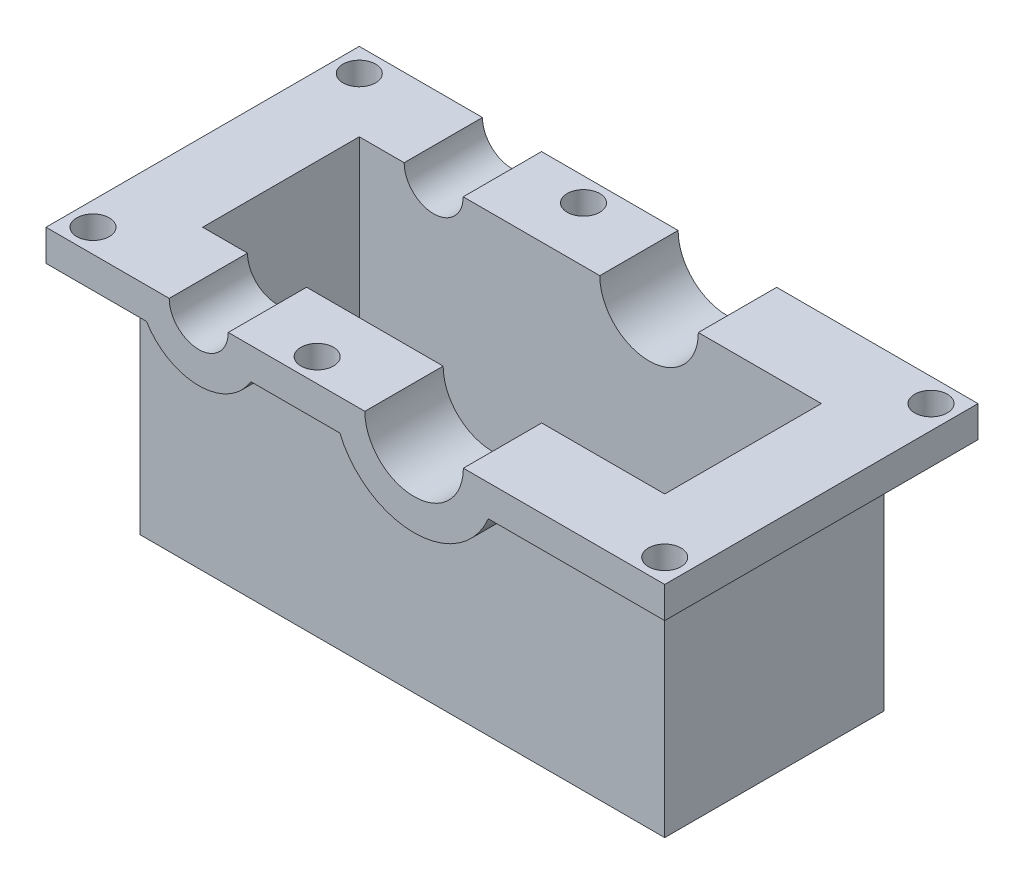
ISO-10303-21;
HEADER;
FILE_DESCRIPTION(('STEP AP214'),'2;1');
FILE_NAME('part.step','',(''),(''),'','','');
FILE_SCHEMA(('AUTOMOTIVE_DESIGN { 1 0 10303 214 1 1 1 1 }'));
ENDSEC;
DATA;
#1=APPLICATION_CONTEXT('core data for automotive mechanical design processes');
#2=APPLICATION_PROTOCOL_DEFINITION('international standard','automotive_design',2000,#1);
#3=PRODUCT_CONTEXT('',#1,'mechanical');
#4=PRODUCT('Part','Part','',(#3));
#5=PRODUCT_RELATED_PRODUCT_CATEGORY('part','',(#4));
#6=PRODUCT_DEFINITION_FORMATION('','',#4);
#7=PRODUCT_DEFINITION_CONTEXT('part definition',#1,'design');
#8=PRODUCT_DEFINITION('design','',#6,#7);
#9=PRODUCT_DEFINITION_SHAPE('','',#8);
#10=(LENGTH_UNIT() NAMED_UNIT(*) SI_UNIT(.MILLI.,.METRE.));
#11=(NAMED_UNIT(*) PLANE_ANGLE_UNIT() SI_UNIT($,.RADIAN.));
#12=(NAMED_UNIT(*) SI_UNIT($,.STERADIAN.) SOLID_ANGLE_UNIT());
#13=UNCERTAINTY_MEASURE_WITH_UNIT(LENGTH_MEASURE(1.E-05),#10,'distance_accuracy_value','');
#14=(GEOMETRIC_REPRESENTATION_CONTEXT(3) GLOBAL_UNCERTAINTY_ASSIGNED_CONTEXT((#13)) GLOBAL_UNIT_ASSIGNED_CONTEXT((#10,
#11,#12)) REPRESENTATION_CONTEXT('',''));
#15=CARTESIAN_POINT('',(0.,0.,0.));
#16=DIRECTION('',(0.,0.,1.));
#17=DIRECTION('',(1.,0.,0.));
#18=AXIS2_PLACEMENT_3D('',#15,#16,#17);
#19=CARTESIAN_POINT('',(0.,19.05,0.));
#20=DIRECTION('',(0.,1.,0.));
#21=DIRECTION('',(0.,0.,1.));
#22=AXIS2_PLACEMENT_3D('',#19,#20,#21);
#23=PLANE('',#22);
#24=DIRECTION('',(0.,0.,-1.));
#25=VECTOR('',#24,1.);
#26=CARTESIAN_POINT('',(-16.9299246568349,19.05,25.3857124006695));
#27=LINE('',#26,#25);
#28=CARTESIAN_POINT('',(-16.9299246568349,19.05,12.7));
#29=VERTEX_POINT('',#28);
#30=CARTESIAN_POINT('',(-16.9299246568349,19.05,8.89));
#31=VERTEX_POINT('',#30);
#32=EDGE_CURVE('E253',#29,#31,#27,.T.);
#33=ORIENTED_EDGE('',*,*,#32,.F.);
#34=DIRECTION('',(1.,0.,0.));
#35=VECTOR('',#34,1.);
#36=CARTESIAN_POINT('',(-25.0825,19.05,12.7));
#37=LINE('',#36,#35);
#38=CARTESIAN_POINT('',(-25.0825,19.05,12.7));
#39=VERTEX_POINT('',#38);
#40=EDGE_CURVE('E266',#39,#29,#37,.T.);
#41=ORIENTED_EDGE('',*,*,#40,.F.);
#42=DIRECTION('',(0.,0.,1.));
#43=VECTOR('',#42,1.);
#44=CARTESIAN_POINT('',(-25.0825,19.05,-12.7));
#45=LINE('',#44,#43);
#46=CARTESIAN_POINT('',(-25.0825,19.05,-12.7));
#47=VERTEX_POINT('',#46);
#48=EDGE_CURVE('E286',#47,#39,#45,.T.);
#49=ORIENTED_EDGE('',*,*,#48,.F.);
#50=DIRECTION('',(-1.,0.,0.));
#51=VECTOR('',#50,1.);
#52=CARTESIAN_POINT('',(-25.0825,19.05,-12.7));
#53=LINE('',#52,#51);
#54=CARTESIAN_POINT('',(-16.9299246568349,19.05,-12.7));
#55=VERTEX_POINT('',#54);
#56=EDGE_CURVE('E297',#55,#47,#53,.T.);
#57=ORIENTED_EDGE('',*,*,#56,.F.);
#58=DIRECTION('',(0.,0.,1.));
#59=VECTOR('',#58,1.);
#60=CARTESIAN_POINT('',(-16.9299246568349,19.05,-25.3857124006695));
#61=LINE('',#60,#59);
#62=CARTESIAN_POINT('',(-16.9299246568349,19.05,-8.89));
#63=VERTEX_POINT('',#62);
#64=EDGE_CURVE('E361',#55,#63,#61,.T.);
#65=ORIENTED_EDGE('',*,*,#64,.T.);
#66=DIRECTION('',(-1.,0.,0.));
#67=VECTOR('',#66,1.);
#68=CARTESIAN_POINT('',(21.2725,19.05,-8.89));
#69=LINE('',#68,#67);
#70=CARTESIAN_POINT('',(-21.2725,19.05,-8.89));
#71=VERTEX_POINT('',#70);
#72=EDGE_CURVE('E310',#63,#71,#69,.T.);
#73=ORIENTED_EDGE('',*,*,#72,.T.);
#74=DIRECTION('',(0.,0.,1.));
#75=VECTOR('',#74,1.);
#76=CARTESIAN_POINT('',(-21.2725,19.05,-8.89));
#77=LINE('',#76,#75);
#78=CARTESIAN_POINT('',(-21.2725,19.05,8.89));
#79=VERTEX_POINT('',#78);
#80=EDGE_CURVE('E319',#71,#79,#77,.T.);
#81=ORIENTED_EDGE('',*,*,#80,.T.);
#82=DIRECTION('',(1.,0.,0.));
#83=VECTOR('',#82,1.);
#84=CARTESIAN_POINT('',(-21.2725,19.05,8.89));
#85=LINE('',#84,#83);
#86=EDGE_CURVE('E268',#79,#31,#85,.T.);
#87=ORIENTED_EDGE('',*,*,#86,.T.);
#88=EDGE_LOOP('',(#33,#41,#49,#57,#65,#73,#81,#87));
#89=FACE_BOUND('',#88,.T.);
#90=CARTESIAN_POINT('',(-23.1775,19.05,-10.795));
#91=DIRECTION('',(0.,1.,0.));
#92=DIRECTION('',(0.,0.,1.));
#93=AXIS2_PLACEMENT_3D('',#90,#91,#92);
#94=CIRCLE('',#93,1.32117066907396);
#95=CARTESIAN_POINT('',(-23.1775,19.05,-9.47382933092604));
#96=VERTEX_POINT('',#95);
#97=EDGE_CURVE('E428',#96,#96,#94,.F.);
#98=ORIENTED_EDGE('',*,*,#97,.F.);
#99=EDGE_LOOP('',(#98));
#100=FACE_BOUND('',#99,.T.);
#101=CARTESIAN_POINT('',(-23.1775,19.05,10.795));
#102=DIRECTION('',(0.,1.,0.));
#103=DIRECTION('',(0.,0.,1.));
#104=AXIS2_PLACEMENT_3D('',#101,#102,#103);
#105=CIRCLE('',#104,1.32117066907396);
#106=CARTESIAN_POINT('',(-23.1775,19.05,12.116170669074));
#107=VERTEX_POINT('',#106);
#108=EDGE_CURVE('E424',#107,#107,#105,.T.);
#109=ORIENTED_EDGE('',*,*,#108,.T.);
#110=EDGE_LOOP('',(#109));
#111=FACE_BOUND('',#110,.T.);
#112=ADVANCED_FACE('F68',(#89,#100,#111),#23,.F.);
#113=DIRECTION('',(0.,0.,-1.));
#114=VECTOR('',#113,1.);
#115=CARTESIAN_POINT('',(10.7827588169031,19.05,25.3857124006695));
#116=LINE('',#115,#114);
#117=CARTESIAN_POINT('',(10.7827588169031,19.05,12.7));
#118=VERTEX_POINT('',#117);
#119=CARTESIAN_POINT('',(10.7827588169031,19.05,8.89));
#120=VERTEX_POINT('',#119);
#121=EDGE_CURVE('E392',#118,#120,#116,.T.);
#122=ORIENTED_EDGE('',*,*,#121,.T.);
#123=CARTESIAN_POINT('',(21.2725,19.05,8.89));
#124=VERTEX_POINT('',#123);
#125=EDGE_CURVE('E318',#120,#124,#85,.T.);
#126=ORIENTED_EDGE('',*,*,#125,.T.);
#127=DIRECTION('',(0.,0.,-1.));
#128=VECTOR('',#127,1.);
#129=CARTESIAN_POINT('',(21.2725,19.05,8.89));
#130=LINE('',#129,#128);
#131=CARTESIAN_POINT('',(21.2725,19.05,-8.89));
#132=VERTEX_POINT('',#131);
#133=EDGE_CURVE('E311',#124,#132,#130,.T.);
#134=ORIENTED_EDGE('',*,*,#133,.T.);
#135=CARTESIAN_POINT('',(10.7827588169031,19.05,-8.89));
#136=VERTEX_POINT('',#135);
#137=EDGE_CURVE('E304',#132,#136,#69,.T.);
#138=ORIENTED_EDGE('',*,*,#137,.T.);
#139=DIRECTION('',(0.,0.,1.));
#140=VECTOR('',#139,1.);
#141=CARTESIAN_POINT('',(10.7827588169031,19.05,-25.3857124006695));
#142=LINE('',#141,#140);
#143=CARTESIAN_POINT('',(10.7827588169031,19.05,-12.7));
#144=VERTEX_POINT('',#143);
#145=EDGE_CURVE('E381',#144,#136,#142,.T.);
#146=ORIENTED_EDGE('',*,*,#145,.F.);
#147=CARTESIAN_POINT('',(25.0825,19.05,-12.7));
#148=VERTEX_POINT('',#147);
#149=EDGE_CURVE('E290',#148,#144,#53,.T.);
#150=ORIENTED_EDGE('',*,*,#149,.F.);
#151=DIRECTION('',(0.,0.,-1.));
#152=VECTOR('',#151,1.);
#153=CARTESIAN_POINT('',(25.0825,19.05,-12.7));
#154=LINE('',#153,#152);
#155=CARTESIAN_POINT('',(25.0825,19.05,12.7));
#156=VERTEX_POINT('',#155);
#157=EDGE_CURVE('E299',#156,#148,#154,.T.);
#158=ORIENTED_EDGE('',*,*,#157,.F.);
#159=EDGE_CURVE('E278',#118,#156,#37,.T.);
#160=ORIENTED_EDGE('',*,*,#159,.F.);
#161=EDGE_LOOP('',(#122,#126,#134,#138,#146,#150,#158,#160));
#162=FACE_BOUND('',#161,.T.);
#163=CARTESIAN_POINT('',(23.1775,19.05,-10.795));
#164=DIRECTION('',(0.,1.,0.));
#165=DIRECTION('',(0.,0.,1.));
#166=AXIS2_PLACEMENT_3D('',#163,#164,#165);
#167=CIRCLE('',#166,1.32117066907396);
#168=CARTESIAN_POINT('',(23.1775,19.05,-9.47382933092604));
#169=VERTEX_POINT('',#168);
#170=EDGE_CURVE('E420',#169,#169,#167,.F.);
#171=ORIENTED_EDGE('',*,*,#170,.F.);
#172=EDGE_LOOP('',(#171));
#173=FACE_BOUND('',#172,.T.);
#174=CARTESIAN_POINT('',(23.1775,19.05,10.795));
#175=DIRECTION('',(0.,1.,0.));
#176=DIRECTION('',(0.,0.,1.));
#177=AXIS2_PLACEMENT_3D('',#174,#175,#176);
#178=CIRCLE('',#177,1.32117066907396);
#179=CARTESIAN_POINT('',(23.1775,19.05,12.116170669074));
#180=VERTEX_POINT('',#179);
#181=EDGE_CURVE('E416',#180,#180,#178,.T.);
#182=ORIENTED_EDGE('',*,*,#181,.T.);
#183=EDGE_LOOP('',(#182));
#184=FACE_BOUND('',#183,.T.);
#185=ADVANCED_FACE('F670',(#162,#173,#184),#23,.F.);
#186=CARTESIAN_POINT('',(0.,21.59,0.));
#187=DIRECTION('',(0.,1.,0.));
#188=DIRECTION('',(0.,0.,1.));
#189=AXIS2_PLACEMENT_3D('',#186,#187,#188);
#190=PLANE('',#189);
#191=CARTESIAN_POINT('',(23.1775,21.59,-10.795));
#192=DIRECTION('',(0.,1.,0.));
#193=DIRECTION('',(0.,0.,1.));
#194=AXIS2_PLACEMENT_3D('',#191,#192,#193);
#195=CIRCLE('',#194,1.32117066907396);
#196=CARTESIAN_POINT('',(23.1775,21.59,-9.47382933092604));
#197=VERTEX_POINT('',#196);
#198=EDGE_CURVE('E432',#197,#197,#195,.T.);
#199=ORIENTED_EDGE('',*,*,#198,.F.);
#200=EDGE_LOOP('',(#199));
#201=FACE_BOUND('',#200,.T.);
#202=DIRECTION('',(0.,0.,-1.));
#203=VECTOR('',#202,1.);
#204=CARTESIAN_POINT('',(8.75665,21.59,23.997162200305));
#205=LINE('',#204,#203);
#206=CARTESIAN_POINT('',(8.75665,21.59,12.7));
#207=VERTEX_POINT('',#206);
#208=CARTESIAN_POINT('',(8.75665,21.59,6.35));
#209=VERTEX_POINT('',#208);
#210=EDGE_CURVE('E336',#207,#209,#205,.T.);
#211=ORIENTED_EDGE('',*,*,#210,.F.);
#212=DIRECTION('',(1.,0.,0.));
#213=VECTOR('',#212,1.);
#214=CARTESIAN_POINT('',(-25.0825,21.59,12.7));
#215=LINE('',#214,#213);
#216=CARTESIAN_POINT('',(25.0825,21.59,12.7));
#217=VERTEX_POINT('',#216);
#218=EDGE_CURVE('E603',#207,#217,#215,.T.);
#219=ORIENTED_EDGE('',*,*,#218,.T.);
#220=DIRECTION('',(0.,0.,-1.));
#221=VECTOR('',#220,1.);
#222=CARTESIAN_POINT('',(25.0825,21.59,-12.7));
#223=LINE('',#222,#221);
#224=CARTESIAN_POINT('',(25.0825,21.59,-12.7));
#225=VERTEX_POINT('',#224);
#226=EDGE_CURVE('E308',#217,#225,#223,.T.);
#227=ORIENTED_EDGE('',*,*,#226,.T.);
#228=DIRECTION('',(-1.,0.,0.));
#229=VECTOR('',#228,1.);
#230=CARTESIAN_POINT('',(-25.0825,21.59,-12.7));
#231=LINE('',#230,#229);
#232=CARTESIAN_POINT('',(8.75665,21.59,-12.7));
#233=VERTEX_POINT('',#232);
#234=EDGE_CURVE('E709',#225,#233,#231,.T.);
#235=ORIENTED_EDGE('',*,*,#234,.T.);
#236=CARTESIAN_POINT('',(8.75665,21.59,-6.35));
#237=VERTEX_POINT('',#236);
#238=EDGE_CURVE('E341',#237,#233,#205,.T.);
#239=ORIENTED_EDGE('',*,*,#238,.F.);
#240=DIRECTION('',(-1.,0.,0.));
#241=VECTOR('',#240,1.);
#242=CARTESIAN_POINT('',(21.2725,21.59,-6.35));
#243=LINE('',#242,#241);
#244=CARTESIAN_POINT('',(18.7325,21.59,-6.35));
#245=VERTEX_POINT('',#244);
#246=EDGE_CURVE('E484',#245,#237,#243,.T.);
#247=ORIENTED_EDGE('',*,*,#246,.F.);
#248=DIRECTION('',(0.,0.,-1.));
#249=VECTOR('',#248,1.);
#250=CARTESIAN_POINT('',(18.7325,21.59,8.89));
#251=LINE('',#250,#249);
#252=CARTESIAN_POINT('',(18.7325,21.59,6.35));
#253=VERTEX_POINT('',#252);
#254=EDGE_CURVE('E490',#253,#245,#251,.T.);
#255=ORIENTED_EDGE('',*,*,#254,.F.);
#256=DIRECTION('',(1.,0.,0.));
#257=VECTOR('',#256,1.);
#258=CARTESIAN_POINT('',(-21.2725,21.59,6.35));
#259=LINE('',#258,#257);
#260=EDGE_CURVE('E510',#209,#253,#259,.T.);
#261=ORIENTED_EDGE('',*,*,#260,.F.);
#262=EDGE_LOOP('',(#211,#219,#227,#235,#239,#247,#255,#261));
#263=FACE_BOUND('',#262,.T.);
#264=CARTESIAN_POINT('',(23.1775,21.59,10.795));
#265=DIRECTION('',(0.,-1.,0.));
#266=DIRECTION('',(0.,0.,-1.));
#267=AXIS2_PLACEMENT_3D('',#264,#265,#266);
#268=CIRCLE('',#267,1.32117066907396);
#269=CARTESIAN_POINT('',(23.1775,21.59,9.47382933092604));
#270=VERTEX_POINT('',#269);
#271=EDGE_CURVE('E437',#270,#270,#268,.T.);
#272=ORIENTED_EDGE('',*,*,#271,.T.);
#273=EDGE_LOOP('',(#272));
#274=FACE_BOUND('',#273,.T.);
#275=ADVANCED_FACE('F640',(#201,#263,#274),#190,.T.);
#276=CARTESIAN_POINT('',(-23.1775,21.59,-10.795));
#277=DIRECTION('',(0.,1.,0.));
#278=DIRECTION('',(0.,0.,1.));
#279=AXIS2_PLACEMENT_3D('',#276,#277,#278);
#280=CIRCLE('',#279,1.32117066907396);
#281=CARTESIAN_POINT('',(-23.1775,21.59,-9.47382933092604));
#282=VERTEX_POINT('',#281);
#283=EDGE_CURVE('E449',#282,#282,#280,.T.);
#284=ORIENTED_EDGE('',*,*,#283,.F.);
#285=EDGE_LOOP('',(#284));
#286=FACE_BOUND('',#285,.T.);
#287=DIRECTION('',(0.,0.,-1.));
#288=VECTOR('',#287,1.);
#289=CARTESIAN_POINT('',(-15.09395,21.59,23.997162200305));
#290=LINE('',#289,#288);
#291=CARTESIAN_POINT('',(-15.09395,21.59,-12.7));
#292=VERTEX_POINT('',#291);
#293=CARTESIAN_POINT('',(-15.09395,21.59,-6.35));
#294=VERTEX_POINT('',#293);
#295=EDGE_CURVE('E330',#292,#294,#290,.F.);
#296=ORIENTED_EDGE('',*,*,#295,.F.);
#297=CARTESIAN_POINT('',(-25.0825,21.59,-12.7));
#298=VERTEX_POINT('',#297);
#299=EDGE_CURVE('E710',#292,#298,#231,.T.);
#300=ORIENTED_EDGE('',*,*,#299,.T.);
#301=DIRECTION('',(0.,0.,1.));
#302=VECTOR('',#301,1.);
#303=CARTESIAN_POINT('',(-25.0825,21.59,-12.7));
#304=LINE('',#303,#302);
#305=CARTESIAN_POINT('',(-25.0825,21.59,12.7));
#306=VERTEX_POINT('',#305);
#307=EDGE_CURVE('E608',#298,#306,#304,.T.);
#308=ORIENTED_EDGE('',*,*,#307,.T.);
#309=CARTESIAN_POINT('',(-15.09395,21.59,12.7));
#310=VERTEX_POINT('',#309);
#311=EDGE_CURVE('E303',#306,#310,#215,.T.);
#312=ORIENTED_EDGE('',*,*,#311,.T.);
#313=CARTESIAN_POINT('',(-15.09395,21.59,6.35));
#314=VERTEX_POINT('',#313);
#315=EDGE_CURVE('E326',#314,#310,#290,.F.);
#316=ORIENTED_EDGE('',*,*,#315,.F.);
#317=CARTESIAN_POINT('',(-18.7325,21.59,6.35));
#318=VERTEX_POINT('',#317);
#319=EDGE_CURVE('E618',#318,#314,#259,.T.);
#320=ORIENTED_EDGE('',*,*,#319,.F.);
#321=DIRECTION('',(0.,0.,1.));
#322=VECTOR('',#321,1.);
#323=CARTESIAN_POINT('',(-18.7325,21.59,-8.89));
#324=LINE('',#323,#322);
#325=CARTESIAN_POINT('',(-18.7325,21.59,-6.35));
#326=VERTEX_POINT('',#325);
#327=EDGE_CURVE('E489',#326,#318,#324,.T.);
#328=ORIENTED_EDGE('',*,*,#327,.F.);
#329=EDGE_CURVE('E485',#294,#326,#243,.T.);
#330=ORIENTED_EDGE('',*,*,#329,.F.);
#331=EDGE_LOOP('',(#296,#300,#308,#312,#316,#320,#328,#330));
#332=FACE_BOUND('',#331,.T.);
#333=CARTESIAN_POINT('',(-23.1775,21.59,10.795));
#334=DIRECTION('',(0.,-1.,0.));
#335=DIRECTION('',(0.,0.,-1.));
#336=AXIS2_PLACEMENT_3D('',#333,#334,#335);
#337=CIRCLE('',#336,1.32117066907396);
#338=CARTESIAN_POINT('',(-23.1775,21.59,9.47382933092604));
#339=VERTEX_POINT('',#338);
#340=EDGE_CURVE('E445',#339,#339,#337,.T.);
#341=ORIENTED_EDGE('',*,*,#340,.T.);
#342=EDGE_LOOP('',(#341));
#343=FACE_BOUND('',#342,.T.);
#344=ADVANCED_FACE('F466',(#286,#332,#343),#190,.T.);
#345=CARTESIAN_POINT('',(-5.00026562264999,19.05,10.795));
#346=DIRECTION('',(0.,1.,0.));
#347=DIRECTION('',(0.,0.,1.));
#348=AXIS2_PLACEMENT_3D('',#345,#346,#347);
#349=CIRCLE('',#348,1.32117066907395);
#350=CARTESIAN_POINT('',(-5.00026562264999,19.05,12.116170669074));
#351=VERTEX_POINT('',#350);
#352=EDGE_CURVE('E412',#351,#351,#349,.T.);
#353=ORIENTED_EDGE('',*,*,#352,.T.);
#354=EDGE_LOOP('',(#353));
#355=FACE_BOUND('',#354,.T.);
#356=DIRECTION('',(0.,0.,-1.));
#357=VECTOR('',#356,1.);
#358=CARTESIAN_POINT('',(-8.47007534316508,19.05,25.3857124006695));
#359=LINE('',#358,#357);
#360=CARTESIAN_POINT('',(-8.47007534316508,19.05,12.7));
#361=VERTEX_POINT('',#360);
#362=CARTESIAN_POINT('',(-8.47007534316508,19.05,8.89));
#363=VERTEX_POINT('',#362);
#364=EDGE_CURVE('E256',#361,#363,#359,.T.);
#365=ORIENTED_EDGE('',*,*,#364,.T.);
#366=CARTESIAN_POINT('',(-1.25775881690314,19.05,8.89));
#367=VERTEX_POINT('',#366);
#368=EDGE_CURVE('E317',#363,#367,#85,.T.);
#369=ORIENTED_EDGE('',*,*,#368,.T.);
#370=DIRECTION('',(0.,0.,-1.));
#371=VECTOR('',#370,1.);
#372=CARTESIAN_POINT('',(-1.25775881690314,19.05,25.3857124006695));
#373=LINE('',#372,#371);
#374=CARTESIAN_POINT('',(-1.25775881690314,19.05,12.7));
#375=VERTEX_POINT('',#374);
#376=EDGE_CURVE('E258',#375,#367,#373,.T.);
#377=ORIENTED_EDGE('',*,*,#376,.F.);
#378=EDGE_CURVE('E89',#361,#375,#37,.T.);
#379=ORIENTED_EDGE('',*,*,#378,.F.);
#380=EDGE_LOOP('',(#365,#369,#377,#379));
#381=FACE_BOUND('',#380,.T.);
#382=ADVANCED_FACE('F676',(#355,#381),#23,.F.);
#383=CARTESIAN_POINT('',(-21.2725,2.54,8.89));
#384=DIRECTION('',(0.,0.,-1.));
#385=DIRECTION('',(-1.,0.,0.));
#386=AXIS2_PLACEMENT_3D('',#383,#384,#385);
#387=PLANE('',#386);
#388=CARTESIAN_POINT('',(-12.7,21.59,8.89));
#389=DIRECTION('',(0.,0.,1.));
#390=DIRECTION('',(1.,0.,0.));
#391=AXIS2_PLACEMENT_3D('',#388,#389,#390);
#392=CIRCLE('',#391,4.93395);
#393=EDGE_CURVE('E259',#31,#363,#392,.T.);
#394=ORIENTED_EDGE('',*,*,#393,.F.);
#395=ORIENTED_EDGE('',*,*,#86,.F.);
#396=DIRECTION('',(0.,-1.,0.));
#397=VECTOR('',#396,1.);
#398=CARTESIAN_POINT('',(-21.2725,2.54,8.89));
#399=LINE('',#398,#397);
#400=CARTESIAN_POINT('',(-21.2725,0.,8.89));
#401=VERTEX_POINT('',#400);
#402=EDGE_CURVE('E545',#79,#401,#399,.T.);
#403=ORIENTED_EDGE('',*,*,#402,.T.);
#404=DIRECTION('',(1.,0.,0.));
#405=VECTOR('',#404,1.);
#406=CARTESIAN_POINT('',(-21.2725,0.,8.89));
#407=LINE('',#406,#405);
#408=CARTESIAN_POINT('',(21.2725,0.,8.89));
#409=VERTEX_POINT('',#408);
#410=EDGE_CURVE('E538',#401,#409,#407,.T.);
#411=ORIENTED_EDGE('',*,*,#410,.T.);
#412=DIRECTION('',(0.,-1.,0.));
#413=VECTOR('',#412,1.);
#414=CARTESIAN_POINT('',(21.2725,2.54,8.89));
#415=LINE('',#414,#413);
#416=EDGE_CURVE('E542',#124,#409,#415,.T.);
#417=ORIENTED_EDGE('',*,*,#416,.F.);
#418=ORIENTED_EDGE('',*,*,#125,.F.);
#419=CARTESIAN_POINT('',(4.7625,21.59,8.89));
#420=DIRECTION('',(0.,0.,1.));
#421=DIRECTION('',(1.,0.,0.));
#422=AXIS2_PLACEMENT_3D('',#419,#420,#421);
#423=CIRCLE('',#422,6.53415);
#424=EDGE_CURVE('E395',#367,#120,#423,.T.);
#425=ORIENTED_EDGE('',*,*,#424,.F.);
#426=ORIENTED_EDGE('',*,*,#368,.F.);
#427=EDGE_LOOP('',(#394,#395,#403,#411,#417,#418,#425,#426));
#428=FACE_BOUND('',#427,.T.);
#429=ADVANCED_FACE('F565',(#428),#387,.F.);
#430=CARTESIAN_POINT('',(-5.00026562264999,19.05,-10.795));
#431=DIRECTION('',(0.,1.,0.));
#432=DIRECTION('',(0.,0.,1.));
#433=AXIS2_PLACEMENT_3D('',#430,#431,#432);
#434=CIRCLE('',#433,1.32117066907395);
#435=CARTESIAN_POINT('',(-5.00026562264999,19.05,-9.47382933092604));
#436=VERTEX_POINT('',#435);
#437=EDGE_CURVE('E405',#436,#436,#434,.F.);
#438=ORIENTED_EDGE('',*,*,#437,.F.);
#439=EDGE_LOOP('',(#438));
#440=FACE_BOUND('',#439,.T.);
#441=DIRECTION('',(0.,0.,1.));
#442=VECTOR('',#441,1.);
#443=CARTESIAN_POINT('',(-1.25775881690314,19.05,-25.3857124006695));
#444=LINE('',#443,#442);
#445=CARTESIAN_POINT('',(-1.25775881690314,19.05,-12.7));
#446=VERTEX_POINT('',#445);
#447=CARTESIAN_POINT('',(-1.25775881690314,19.05,-8.89));
#448=VERTEX_POINT('',#447);
#449=EDGE_CURVE('E377',#446,#448,#444,.T.);
#450=ORIENTED_EDGE('',*,*,#449,.T.);
#451=CARTESIAN_POINT('',(-8.47007534316509,19.05,-8.89));
#452=VERTEX_POINT('',#451);
#453=EDGE_CURVE('E309',#448,#452,#69,.T.);
#454=ORIENTED_EDGE('',*,*,#453,.T.);
#455=DIRECTION('',(0.,0.,1.));
#456=VECTOR('',#455,1.);
#457=CARTESIAN_POINT('',(-8.47007534316509,19.05,-25.3857124006695));
#458=LINE('',#457,#456);
#459=CARTESIAN_POINT('',(-8.47007534316508,19.05,-12.7));
#460=VERTEX_POINT('',#459);
#461=EDGE_CURVE('E365',#460,#452,#458,.T.);
#462=ORIENTED_EDGE('',*,*,#461,.F.);
#463=EDGE_CURVE('E295',#446,#460,#53,.T.);
#464=ORIENTED_EDGE('',*,*,#463,.F.);
#465=EDGE_LOOP('',(#450,#454,#462,#464));
#466=FACE_BOUND('',#465,.T.);
#467=ADVANCED_FACE('F579',(#440,#466),#23,.F.);
#468=CARTESIAN_POINT('',(-21.2725,2.54,-8.89));
#469=DIRECTION('',(0.,0.,1.));
#470=DIRECTION('',(1.,0.,0.));
#471=AXIS2_PLACEMENT_3D('',#468,#469,#470);
#472=PLANE('',#471);
#473=CARTESIAN_POINT('',(4.7625,21.59,-8.89));
#474=DIRECTION('',(0.,0.,-1.));
#475=DIRECTION('',(-1.,0.,0.));
#476=AXIS2_PLACEMENT_3D('',#473,#474,#475);
#477=CIRCLE('',#476,6.53415);
#478=EDGE_CURVE('E380',#136,#448,#477,.T.);
#479=ORIENTED_EDGE('',*,*,#478,.F.);
#480=ORIENTED_EDGE('',*,*,#137,.F.);
#481=DIRECTION('',(0.,-1.,0.));
#482=VECTOR('',#481,1.);
#483=CARTESIAN_POINT('',(21.2725,2.54,-8.89));
#484=LINE('',#483,#482);
#485=CARTESIAN_POINT('',(21.2725,0.,-8.89));
#486=VERTEX_POINT('',#485);
#487=EDGE_CURVE('E77',#132,#486,#484,.T.);
#488=ORIENTED_EDGE('',*,*,#487,.T.);
#489=DIRECTION('',(-1.,0.,0.));
#490=VECTOR('',#489,1.);
#491=CARTESIAN_POINT('',(-21.2725,0.,-8.89));
#492=LINE('',#491,#490);
#493=CARTESIAN_POINT('',(-21.2725,0.,-8.89));
#494=VERTEX_POINT('',#493);
#495=EDGE_CURVE('E530',#486,#494,#492,.T.);
#496=ORIENTED_EDGE('',*,*,#495,.T.);
#497=DIRECTION('',(0.,-1.,0.));
#498=VECTOR('',#497,1.);
#499=CARTESIAN_POINT('',(-21.2725,2.54,-8.89));
#500=LINE('',#499,#498);
#501=EDGE_CURVE('E548',#71,#494,#500,.T.);
#502=ORIENTED_EDGE('',*,*,#501,.F.);
#503=ORIENTED_EDGE('',*,*,#72,.F.);
#504=CARTESIAN_POINT('',(-12.7,21.59,-8.89));
#505=DIRECTION('',(0.,0.,-1.));
#506=DIRECTION('',(-1.,0.,0.));
#507=AXIS2_PLACEMENT_3D('',#504,#505,#506);
#508=CIRCLE('',#507,4.93395);
#509=EDGE_CURVE('E370',#452,#63,#508,.T.);
#510=ORIENTED_EDGE('',*,*,#509,.F.);
#511=ORIENTED_EDGE('',*,*,#453,.F.);
#512=EDGE_LOOP('',(#479,#480,#488,#496,#502,#503,#510,#511));
#513=FACE_BOUND('',#512,.T.);
#514=ADVANCED_FACE('F464',(#513),#472,.F.);
#515=CARTESIAN_POINT('',(-5.00026562264999,21.59,-10.795));
#516=DIRECTION('',(0.,1.,0.));
#517=DIRECTION('',(0.,0.,1.));
#518=AXIS2_PLACEMENT_3D('',#515,#516,#517);
#519=CIRCLE('',#518,1.32117066907395);
#520=CARTESIAN_POINT('',(-5.00026562264999,21.59,-9.47382933092604));
#521=VERTEX_POINT('',#520);
#522=EDGE_CURVE('E436',#521,#521,#519,.T.);
#523=ORIENTED_EDGE('',*,*,#522,.F.);
#524=EDGE_LOOP('',(#523));
#525=FACE_BOUND('',#524,.T.);
#526=DIRECTION('',(0.,0.,-1.));
#527=VECTOR('',#526,1.);
#528=CARTESIAN_POINT('',(-10.30605,21.59,23.997162200305));
#529=LINE('',#528,#527);
#530=CARTESIAN_POINT('',(-10.30605,21.59,-6.35));
#531=VERTEX_POINT('',#530);
#532=CARTESIAN_POINT('',(-10.30605,21.59,-12.7));
#533=VERTEX_POINT('',#532);
#534=EDGE_CURVE('E327',#531,#533,#529,.T.);
#535=ORIENTED_EDGE('',*,*,#534,.F.);
#536=CARTESIAN_POINT('',(0.768350000000003,21.59,-6.35));
#537=VERTEX_POINT('',#536);
#538=EDGE_CURVE('E472',#537,#531,#243,.T.);
#539=ORIENTED_EDGE('',*,*,#538,.F.);
#540=DIRECTION('',(0.,0.,-1.));
#541=VECTOR('',#540,1.);
#542=CARTESIAN_POINT('',(0.768350000000003,21.59,23.997162200305));
#543=LINE('',#542,#541);
#544=CARTESIAN_POINT('',(0.768350000000003,21.59,-12.7));
#545=VERTEX_POINT('',#544);
#546=EDGE_CURVE('E344',#545,#537,#543,.F.);
#547=ORIENTED_EDGE('',*,*,#546,.F.);
#548=EDGE_CURVE('E474',#545,#533,#231,.T.);
#549=ORIENTED_EDGE('',*,*,#548,.T.);
#550=EDGE_LOOP('',(#535,#539,#547,#549));
#551=FACE_BOUND('',#550,.T.);
#552=ADVANCED_FACE('F460',(#525,#551),#190,.T.);
#553=CARTESIAN_POINT('',(-5.00026562264999,21.59,10.795));
#554=DIRECTION('',(0.,-1.,0.));
#555=DIRECTION('',(0.,0.,-1.));
#556=AXIS2_PLACEMENT_3D('',#553,#554,#555);
#557=CIRCLE('',#556,1.32117066907395);
#558=CARTESIAN_POINT('',(-5.00026562264999,21.59,9.47382933092604));
#559=VERTEX_POINT('',#558);
#560=EDGE_CURVE('E441',#559,#559,#557,.T.);
#561=ORIENTED_EDGE('',*,*,#560,.T.);
#562=EDGE_LOOP('',(#561));
#563=FACE_BOUND('',#562,.T.);
#564=CARTESIAN_POINT('',(-10.30605,21.59,12.7));
#565=VERTEX_POINT('',#564);
#566=CARTESIAN_POINT('',(-10.30605,21.59,6.35));
#567=VERTEX_POINT('',#566);
#568=EDGE_CURVE('E322',#565,#567,#529,.T.);
#569=ORIENTED_EDGE('',*,*,#568,.F.);
#570=CARTESIAN_POINT('',(0.768350000000003,21.59,12.7));
#571=VERTEX_POINT('',#570);
#572=EDGE_CURVE('E601',#565,#571,#215,.T.);
#573=ORIENTED_EDGE('',*,*,#572,.T.);
#574=CARTESIAN_POINT('',(0.768350000000003,21.59,6.35));
#575=VERTEX_POINT('',#574);
#576=EDGE_CURVE('E340',#575,#571,#543,.F.);
#577=ORIENTED_EDGE('',*,*,#576,.F.);
#578=EDGE_CURVE('E621',#567,#575,#259,.T.);
#579=ORIENTED_EDGE('',*,*,#578,.F.);
#580=EDGE_LOOP('',(#569,#573,#577,#579));
#581=FACE_BOUND('',#580,.T.);
#582=ADVANCED_FACE('F463',(#563,#581),#190,.T.);
#583=CARTESIAN_POINT('',(-21.2725,21.59,6.35));
#584=DIRECTION('',(0.,0.,-1.));
#585=DIRECTION('',(-1.,0.,0.));
#586=AXIS2_PLACEMENT_3D('',#583,#584,#585);
#587=PLANE('',#586);
#588=CARTESIAN_POINT('',(-12.7,21.59,6.35));
#589=DIRECTION('',(0.,0.,-1.));
#590=DIRECTION('',(-1.,0.,0.));
#591=AXIS2_PLACEMENT_3D('',#588,#589,#590);
#592=CIRCLE('',#591,2.39395);
#593=EDGE_CURVE('E323',#567,#314,#592,.T.);
#594=ORIENTED_EDGE('',*,*,#593,.F.);
#595=ORIENTED_EDGE('',*,*,#578,.T.);
#596=CARTESIAN_POINT('',(4.7625,21.59,6.35));
#597=DIRECTION('',(0.,0.,-1.));
#598=DIRECTION('',(-1.,0.,0.));
#599=AXIS2_PLACEMENT_3D('',#596,#597,#598);
#600=CIRCLE('',#599,3.99415);
#601=EDGE_CURVE('E337',#209,#575,#600,.T.);
#602=ORIENTED_EDGE('',*,*,#601,.F.);
#603=ORIENTED_EDGE('',*,*,#260,.T.);
#604=DIRECTION('',(0.,-1.,0.));
#605=VECTOR('',#604,1.);
#606=CARTESIAN_POINT('',(18.7325,21.59,6.35));
#607=LINE('',#606,#605);
#608=CARTESIAN_POINT('',(18.7325,2.54,6.35));
#609=VERTEX_POINT('',#608);
#610=EDGE_CURVE('E522',#253,#609,#607,.T.);
#611=ORIENTED_EDGE('',*,*,#610,.T.);
#612=DIRECTION('',(1.,0.,0.));
#613=VECTOR('',#612,1.);
#614=CARTESIAN_POINT('',(-21.2725,2.54,6.35));
#615=LINE('',#614,#613);
#616=CARTESIAN_POINT('',(-18.7325,2.54,6.35));
#617=VERTEX_POINT('',#616);
#618=EDGE_CURVE('E497',#617,#609,#615,.T.);
#619=ORIENTED_EDGE('',*,*,#618,.F.);
#620=DIRECTION('',(0.,-1.,0.));
#621=VECTOR('',#620,1.);
#622=CARTESIAN_POINT('',(-18.7325,21.59,6.35));
#623=LINE('',#622,#621);
#624=EDGE_CURVE('E496',#318,#617,#623,.T.);
#625=ORIENTED_EDGE('',*,*,#624,.F.);
#626=ORIENTED_EDGE('',*,*,#319,.T.);
#627=EDGE_LOOP('',(#594,#595,#602,#603,#611,#619,#625,#626));
#628=FACE_BOUND('',#627,.T.);
#629=ADVANCED_FACE('F631',(#628),#587,.T.);
#630=CARTESIAN_POINT('',(18.7325,21.59,8.89));
#631=DIRECTION('',(-1.,0.,0.));
#632=DIRECTION('',(0.,0.,1.));
#633=AXIS2_PLACEMENT_3D('',#630,#631,#632);
#634=PLANE('',#633);
#635=DIRECTION('',(0.,0.,-1.));
#636=VECTOR('',#635,1.);
#637=CARTESIAN_POINT('',(18.7325,2.54,8.89));
#638=LINE('',#637,#636);
#639=CARTESIAN_POINT('',(18.7325,2.54,-6.35));
#640=VERTEX_POINT('',#639);
#641=EDGE_CURVE('E500',#609,#640,#638,.T.);
#642=ORIENTED_EDGE('',*,*,#641,.F.);
#643=ORIENTED_EDGE('',*,*,#610,.F.);
#644=ORIENTED_EDGE('',*,*,#254,.T.);
#645=DIRECTION('',(0.,-1.,0.));
#646=VECTOR('',#645,1.);
#647=CARTESIAN_POINT('',(18.7325,21.59,-6.35));
#648=LINE('',#647,#646);
#649=EDGE_CURVE('E518',#245,#640,#648,.T.);
#650=ORIENTED_EDGE('',*,*,#649,.T.);
#651=EDGE_LOOP('',(#642,#643,#644,#650));
#652=FACE_BOUND('',#651,.T.);
#653=ADVANCED_FACE('F637',(#652),#634,.T.);
#654=CARTESIAN_POINT('',(21.2725,21.59,-6.35));
#655=DIRECTION('',(0.,0.,1.));
#656=DIRECTION('',(1.,0.,0.));
#657=AXIS2_PLACEMENT_3D('',#654,#655,#656);
#658=PLANE('',#657);
#659=CARTESIAN_POINT('',(-12.7,21.59,-6.35));
#660=DIRECTION('',(0.,0.,1.));
#661=DIRECTION('',(1.,0.,0.));
#662=AXIS2_PLACEMENT_3D('',#659,#660,#661);
#663=CIRCLE('',#662,2.39395);
#664=EDGE_CURVE('E333',#294,#531,#663,.T.);
#665=ORIENTED_EDGE('',*,*,#664,.F.);
#666=ORIENTED_EDGE('',*,*,#329,.T.);
#667=DIRECTION('',(0.,-1.,0.));
#668=VECTOR('',#667,1.);
#669=CARTESIAN_POINT('',(-18.7325,21.59,-6.35));
#670=LINE('',#669,#668);
#671=CARTESIAN_POINT('',(-18.7325,2.54,-6.35));
#672=VERTEX_POINT('',#671);
#673=EDGE_CURVE('E514',#326,#672,#670,.T.);
#674=ORIENTED_EDGE('',*,*,#673,.T.);
#675=DIRECTION('',(-1.,0.,0.));
#676=VECTOR('',#675,1.);
#677=CARTESIAN_POINT('',(21.2725,2.54,-6.35));
#678=LINE('',#677,#676);
#679=EDGE_CURVE('E504',#640,#672,#678,.T.);
#680=ORIENTED_EDGE('',*,*,#679,.F.);
#681=ORIENTED_EDGE('',*,*,#649,.F.);
#682=ORIENTED_EDGE('',*,*,#246,.T.);
#683=CARTESIAN_POINT('',(4.7625,21.59,-6.35));
#684=DIRECTION('',(0.,0.,1.));
#685=DIRECTION('',(1.,0.,0.));
#686=AXIS2_PLACEMENT_3D('',#683,#684,#685);
#687=CIRCLE('',#686,3.99415);
#688=EDGE_CURVE('E347',#537,#237,#687,.T.);
#689=ORIENTED_EDGE('',*,*,#688,.F.);
#690=ORIENTED_EDGE('',*,*,#538,.T.);
#691=EDGE_LOOP('',(#665,#666,#674,#680,#681,#682,#689,#690));
#692=FACE_BOUND('',#691,.T.);
#693=ADVANCED_FACE('F480',(#692),#658,.T.);
#694=CARTESIAN_POINT('',(-18.7325,21.59,-8.89));
#695=DIRECTION('',(1.,0.,0.));
#696=DIRECTION('',(0.,0.,-1.));
#697=AXIS2_PLACEMENT_3D('',#694,#695,#696);
#698=PLANE('',#697);
#699=DIRECTION('',(0.,0.,1.));
#700=VECTOR('',#699,1.);
#701=CARTESIAN_POINT('',(-18.7325,2.54,-8.89));
#702=LINE('',#701,#700);
#703=EDGE_CURVE('E507',#672,#617,#702,.T.);
#704=ORIENTED_EDGE('',*,*,#703,.F.);
#705=ORIENTED_EDGE('',*,*,#673,.F.);
#706=ORIENTED_EDGE('',*,*,#327,.T.);
#707=ORIENTED_EDGE('',*,*,#624,.T.);
#708=EDGE_LOOP('',(#704,#705,#706,#707));
#709=FACE_BOUND('',#708,.T.);
#710=ADVANCED_FACE('F650',(#709),#698,.T.);
#711=CARTESIAN_POINT('',(0.,2.54,0.));
#712=DIRECTION('',(0.,1.,0.));
#713=DIRECTION('',(0.,0.,1.));
#714=AXIS2_PLACEMENT_3D('',#711,#712,#713);
#715=PLANE('',#714);
#716=ORIENTED_EDGE('',*,*,#618,.T.);
#717=ORIENTED_EDGE('',*,*,#641,.T.);
#718=ORIENTED_EDGE('',*,*,#679,.T.);
#719=ORIENTED_EDGE('',*,*,#703,.T.);
#720=EDGE_LOOP('',(#716,#717,#718,#719));
#721=FACE_BOUND('',#720,.T.);
#722=ADVANCED_FACE('F648',(#721),#715,.T.);
#723=CARTESIAN_POINT('',(25.0825,19.05,-12.7));
#724=DIRECTION('',(1.,0.,0.));
#725=DIRECTION('',(0.,0.,-1.));
#726=AXIS2_PLACEMENT_3D('',#723,#724,#725);
#727=PLANE('',#726);
#728=ORIENTED_EDGE('',*,*,#226,.F.);
#729=DIRECTION('',(0.,1.,0.));
#730=VECTOR('',#729,1.);
#731=CARTESIAN_POINT('',(25.0825,19.05,12.7));
#732=LINE('',#731,#730);
#733=EDGE_CURVE('E501',#156,#217,#732,.T.);
#734=ORIENTED_EDGE('',*,*,#733,.F.);
#735=ORIENTED_EDGE('',*,*,#157,.T.);
#736=DIRECTION('',(0.,1.,0.));
#737=VECTOR('',#736,1.);
#738=CARTESIAN_POINT('',(25.0825,19.05,-12.7));
#739=LINE('',#738,#737);
#740=EDGE_CURVE('E276',#148,#225,#739,.T.);
#741=ORIENTED_EDGE('',*,*,#740,.T.);
#742=EDGE_LOOP('',(#728,#734,#735,#741));
#743=FACE_BOUND('',#742,.T.);
#744=ADVANCED_FACE('F705',(#743),#727,.T.);
#745=CARTESIAN_POINT('',(-25.0825,19.05,12.7));
#746=DIRECTION('',(0.,0.,1.));
#747=DIRECTION('',(1.,0.,0.));
#748=AXIS2_PLACEMENT_3D('',#745,#746,#747);
#749=PLANE('',#748);
#750=CARTESIAN_POINT('',(4.7625,21.59,12.7));
#751=DIRECTION('',(0.,0.,1.));
#752=DIRECTION('',(1.,0.,0.));
#753=AXIS2_PLACEMENT_3D('',#750,#751,#752);
#754=CIRCLE('',#753,3.99415);
#755=EDGE_CURVE('E354',#207,#571,#754,.F.);
#756=ORIENTED_EDGE('',*,*,#755,.T.);
#757=ORIENTED_EDGE('',*,*,#572,.F.);
#758=CARTESIAN_POINT('',(-12.7,21.59,12.7));
#759=DIRECTION('',(0.,0.,1.));
#760=DIRECTION('',(1.,0.,0.));
#761=AXIS2_PLACEMENT_3D('',#758,#759,#760);
#762=CIRCLE('',#761,2.39395);
#763=EDGE_CURVE('E350',#565,#310,#762,.F.);
#764=ORIENTED_EDGE('',*,*,#763,.T.);
#765=ORIENTED_EDGE('',*,*,#311,.F.);
#766=DIRECTION('',(0.,1.,0.));
#767=VECTOR('',#766,1.);
#768=CARTESIAN_POINT('',(-25.0825,19.05,12.7));
#769=LINE('',#768,#767);
#770=EDGE_CURVE('E273',#39,#306,#769,.T.);
#771=ORIENTED_EDGE('',*,*,#770,.F.);
#772=ORIENTED_EDGE('',*,*,#40,.T.);
#773=CARTESIAN_POINT('',(-12.7,21.59,12.7));
#774=DIRECTION('',(0.,0.,1.));
#775=DIRECTION('',(1.,0.,0.));
#776=AXIS2_PLACEMENT_3D('',#773,#774,#775);
#777=CIRCLE('',#776,4.93395);
#778=EDGE_CURVE('E84',#29,#361,#777,.T.);
#779=ORIENTED_EDGE('',*,*,#778,.T.);
#780=ORIENTED_EDGE('',*,*,#378,.T.);
#781=CARTESIAN_POINT('',(4.7625,21.59,12.7));
#782=DIRECTION('',(0.,0.,1.));
#783=DIRECTION('',(1.,0.,0.));
#784=AXIS2_PLACEMENT_3D('',#781,#782,#783);
#785=CIRCLE('',#784,6.53415);
#786=EDGE_CURVE('E385',#375,#118,#785,.T.);
#787=ORIENTED_EDGE('',*,*,#786,.T.);
#788=ORIENTED_EDGE('',*,*,#159,.T.);
#789=ORIENTED_EDGE('',*,*,#733,.T.);
#790=ORIENTED_EDGE('',*,*,#218,.F.);
#791=EDGE_LOOP('',(#756,#757,#764,#765,#771,#772,#779,#780,#787,#788,#789,#790));
#792=FACE_BOUND('',#791,.T.);
#793=ADVANCED_FACE('F271',(#792),#749,.T.);
#794=CARTESIAN_POINT('',(-25.0825,19.05,-12.7));
#795=DIRECTION('',(-1.,0.,0.));
#796=DIRECTION('',(0.,0.,1.));
#797=AXIS2_PLACEMENT_3D('',#794,#795,#796);
#798=PLANE('',#797);
#799=ORIENTED_EDGE('',*,*,#307,.F.);
#800=DIRECTION('',(0.,1.,0.));
#801=VECTOR('',#800,1.);
#802=CARTESIAN_POINT('',(-25.0825,19.05,-12.7));
#803=LINE('',#802,#801);
#804=EDGE_CURVE('E281',#47,#298,#803,.T.);
#805=ORIENTED_EDGE('',*,*,#804,.F.);
#806=ORIENTED_EDGE('',*,*,#48,.T.);
#807=ORIENTED_EDGE('',*,*,#770,.T.);
#808=EDGE_LOOP('',(#799,#805,#806,#807));
#809=FACE_BOUND('',#808,.T.);
#810=ADVANCED_FACE('F717',(#809),#798,.T.);
#811=CARTESIAN_POINT('',(-25.0825,19.05,-12.7));
#812=DIRECTION('',(0.,0.,-1.));
#813=DIRECTION('',(-1.,0.,0.));
#814=AXIS2_PLACEMENT_3D('',#811,#812,#813);
#815=PLANE('',#814);
#816=CARTESIAN_POINT('',(-12.7,21.59,-12.7));
#817=DIRECTION('',(0.,0.,-1.));
#818=DIRECTION('',(-1.,0.,0.));
#819=AXIS2_PLACEMENT_3D('',#816,#817,#818);
#820=CIRCLE('',#819,2.39395);
#821=EDGE_CURVE('E12',#533,#292,#820,.T.);
#822=ORIENTED_EDGE('',*,*,#821,.F.);
#823=ORIENTED_EDGE('',*,*,#548,.F.);
#824=CARTESIAN_POINT('',(4.7625,21.59,-12.7));
#825=DIRECTION('',(0.,0.,-1.));
#826=DIRECTION('',(-1.,0.,0.));
#827=AXIS2_PLACEMENT_3D('',#824,#825,#826);
#828=CIRCLE('',#827,3.99415);
#829=EDGE_CURVE('E351',#233,#545,#828,.T.);
#830=ORIENTED_EDGE('',*,*,#829,.F.);
#831=ORIENTED_EDGE('',*,*,#234,.F.);
#832=ORIENTED_EDGE('',*,*,#740,.F.);
#833=ORIENTED_EDGE('',*,*,#149,.T.);
#834=CARTESIAN_POINT('',(4.7625,21.59,-12.7));
#835=DIRECTION('',(0.,0.,-1.));
#836=DIRECTION('',(-1.,0.,0.));
#837=AXIS2_PLACEMENT_3D('',#834,#835,#836);
#838=CIRCLE('',#837,6.53415);
#839=EDGE_CURVE('E366',#144,#446,#838,.T.);
#840=ORIENTED_EDGE('',*,*,#839,.T.);
#841=ORIENTED_EDGE('',*,*,#463,.T.);
#842=CARTESIAN_POINT('',(-12.7,21.59,-12.7));
#843=DIRECTION('',(0.,0.,-1.));
#844=DIRECTION('',(-1.,0.,0.));
#845=AXIS2_PLACEMENT_3D('',#842,#843,#844);
#846=CIRCLE('',#845,4.93395);
#847=EDGE_CURVE('E357',#460,#55,#846,.T.);
#848=ORIENTED_EDGE('',*,*,#847,.T.);
#849=ORIENTED_EDGE('',*,*,#56,.T.);
#850=ORIENTED_EDGE('',*,*,#804,.T.);
#851=ORIENTED_EDGE('',*,*,#299,.F.);
#852=EDGE_LOOP('',(#822,#823,#830,#831,#832,#833,#840,#841,#848,#849,#850,#851));
#853=FACE_BOUND('',#852,.T.);
#854=ADVANCED_FACE('F719',(#853),#815,.T.);
#855=CARTESIAN_POINT('',(0.,0.,0.));
#856=DIRECTION('',(0.,1.,0.));
#857=DIRECTION('',(0.,0.,1.));
#858=AXIS2_PLACEMENT_3D('',#855,#856,#857);
#859=PLANE('',#858);
#860=DIRECTION('',(0.,0.,-1.));
#861=VECTOR('',#860,1.);
#862=CARTESIAN_POINT('',(21.2725,0.,-8.89));
#863=LINE('',#862,#861);
#864=EDGE_CURVE('E526',#409,#486,#863,.T.);
#865=ORIENTED_EDGE('',*,*,#864,.F.);
#866=ORIENTED_EDGE('',*,*,#410,.F.);
#867=DIRECTION('',(0.,0.,1.));
#868=VECTOR('',#867,1.);
#869=CARTESIAN_POINT('',(-21.2725,0.,-8.89));
#870=LINE('',#869,#868);
#871=EDGE_CURVE('E534',#494,#401,#870,.T.);
#872=ORIENTED_EDGE('',*,*,#871,.F.);
#873=ORIENTED_EDGE('',*,*,#495,.F.);
#874=EDGE_LOOP('',(#865,#866,#872,#873));
#875=FACE_BOUND('',#874,.T.);
#876=ADVANCED_FACE('F560',(#875),#859,.F.);
#877=CARTESIAN_POINT('',(-21.2725,2.54,-8.89));
#878=DIRECTION('',(1.,0.,0.));
#879=DIRECTION('',(0.,0.,-1.));
#880=AXIS2_PLACEMENT_3D('',#877,#878,#879);
#881=PLANE('',#880);
#882=ORIENTED_EDGE('',*,*,#80,.F.);
#883=ORIENTED_EDGE('',*,*,#501,.T.);
#884=ORIENTED_EDGE('',*,*,#871,.T.);
#885=ORIENTED_EDGE('',*,*,#402,.F.);
#886=EDGE_LOOP('',(#882,#883,#884,#885));
#887=FACE_BOUND('',#886,.T.);
#888=ADVANCED_FACE('F569',(#887),#881,.F.);
#889=CARTESIAN_POINT('',(21.2725,2.54,-8.89));
#890=DIRECTION('',(-1.,0.,0.));
#891=DIRECTION('',(0.,0.,1.));
#892=AXIS2_PLACEMENT_3D('',#889,#890,#891);
#893=PLANE('',#892);
#894=ORIENTED_EDGE('',*,*,#133,.F.);
#895=ORIENTED_EDGE('',*,*,#416,.T.);
#896=ORIENTED_EDGE('',*,*,#864,.T.);
#897=ORIENTED_EDGE('',*,*,#487,.F.);
#898=EDGE_LOOP('',(#894,#895,#896,#897));
#899=FACE_BOUND('',#898,.T.);
#900=ADVANCED_FACE('F70',(#899),#893,.F.);
#901=CARTESIAN_POINT('',(4.7625,21.59,23.997162200305));
#902=DIRECTION('',(0.,0.,-1.));
#903=DIRECTION('',(-1.,0.,0.));
#904=AXIS2_PLACEMENT_3D('',#901,#902,#903);
#905=CYLINDRICAL_SURFACE('',#904,3.99415);
#906=ORIENTED_EDGE('',*,*,#829,.T.);
#907=ORIENTED_EDGE('',*,*,#546,.T.);
#908=ORIENTED_EDGE('',*,*,#688,.T.);
#909=ORIENTED_EDGE('',*,*,#238,.T.);
#910=EDGE_LOOP('',(#906,#907,#908,#909));
#911=FACE_BOUND('',#910,.T.);
#912=ADVANCED_FACE('F795',(#911),#905,.F.);
#913=ORIENTED_EDGE('',*,*,#576,.T.);
#914=ORIENTED_EDGE('',*,*,#755,.F.);
#915=ORIENTED_EDGE('',*,*,#210,.T.);
#916=ORIENTED_EDGE('',*,*,#601,.T.);
#917=EDGE_LOOP('',(#913,#914,#915,#916));
#918=FACE_BOUND('',#917,.T.);
#919=ADVANCED_FACE('F593',(#918),#905,.F.);
#920=CARTESIAN_POINT('',(-12.7,21.59,23.997162200305));
#921=DIRECTION('',(0.,0.,-1.));
#922=DIRECTION('',(-1.,0.,0.));
#923=AXIS2_PLACEMENT_3D('',#920,#921,#922);
#924=CYLINDRICAL_SURFACE('',#923,2.39395);
#925=ORIENTED_EDGE('',*,*,#534,.T.);
#926=ORIENTED_EDGE('',*,*,#821,.T.);
#927=ORIENTED_EDGE('',*,*,#295,.T.);
#928=ORIENTED_EDGE('',*,*,#664,.T.);
#929=EDGE_LOOP('',(#925,#926,#927,#928));
#930=FACE_BOUND('',#929,.T.);
#931=ADVANCED_FACE('F660',(#930),#924,.F.);
#932=ORIENTED_EDGE('',*,*,#568,.T.);
#933=ORIENTED_EDGE('',*,*,#593,.T.);
#934=ORIENTED_EDGE('',*,*,#315,.T.);
#935=ORIENTED_EDGE('',*,*,#763,.F.);
#936=EDGE_LOOP('',(#932,#933,#934,#935));
#937=FACE_BOUND('',#936,.T.);
#938=ADVANCED_FACE('F658',(#937),#924,.F.);
#939=CARTESIAN_POINT('',(-12.7,21.59,-25.3857124006695));
#940=DIRECTION('',(0.,0.,1.));
#941=DIRECTION('',(1.,0.,0.));
#942=AXIS2_PLACEMENT_3D('',#939,#940,#941);
#943=CYLINDRICAL_SURFACE('',#942,4.93395);
#944=ORIENTED_EDGE('',*,*,#847,.F.);
#945=ORIENTED_EDGE('',*,*,#461,.T.);
#946=ORIENTED_EDGE('',*,*,#509,.T.);
#947=ORIENTED_EDGE('',*,*,#64,.F.);
#948=EDGE_LOOP('',(#944,#945,#946,#947));
#949=FACE_BOUND('',#948,.T.);
#950=ADVANCED_FACE('F576',(#949),#943,.T.);
#951=CARTESIAN_POINT('',(4.7625,21.59,-25.3857124006695));
#952=DIRECTION('',(0.,0.,1.));
#953=DIRECTION('',(1.,0.,0.));
#954=AXIS2_PLACEMENT_3D('',#951,#952,#953);
#955=CYLINDRICAL_SURFACE('',#954,6.53415);
#956=ORIENTED_EDGE('',*,*,#839,.F.);
#957=ORIENTED_EDGE('',*,*,#145,.T.);
#958=ORIENTED_EDGE('',*,*,#478,.T.);
#959=ORIENTED_EDGE('',*,*,#449,.F.);
#960=EDGE_LOOP('',(#956,#957,#958,#959));
#961=FACE_BOUND('',#960,.T.);
#962=ADVANCED_FACE('F666',(#961),#955,.T.);
#963=CARTESIAN_POINT('',(4.7625,21.59,25.3857124006695));
#964=DIRECTION('',(0.,0.,-1.));
#965=DIRECTION('',(-1.,0.,0.));
#966=AXIS2_PLACEMENT_3D('',#963,#964,#965);
#967=CYLINDRICAL_SURFACE('',#966,6.53415);
#968=ORIENTED_EDGE('',*,*,#786,.F.);
#969=ORIENTED_EDGE('',*,*,#376,.T.);
#970=ORIENTED_EDGE('',*,*,#424,.T.);
#971=ORIENTED_EDGE('',*,*,#121,.F.);
#972=EDGE_LOOP('',(#968,#969,#970,#971));
#973=FACE_BOUND('',#972,.T.);
#974=ADVANCED_FACE('F699',(#973),#967,.T.);
#975=CARTESIAN_POINT('',(-12.7,21.59,25.3857124006695));
#976=DIRECTION('',(0.,0.,-1.));
#977=DIRECTION('',(-1.,0.,0.));
#978=AXIS2_PLACEMENT_3D('',#975,#976,#977);
#979=CYLINDRICAL_SURFACE('',#978,4.93395);
#980=ORIENTED_EDGE('',*,*,#778,.F.);
#981=ORIENTED_EDGE('',*,*,#32,.T.);
#982=ORIENTED_EDGE('',*,*,#393,.T.);
#983=ORIENTED_EDGE('',*,*,#364,.F.);
#984=EDGE_LOOP('',(#980,#981,#982,#983));
#985=FACE_BOUND('',#984,.T.);
#986=ADVANCED_FACE('F252',(#985),#979,.T.);
#987=CARTESIAN_POINT('',(-23.1775,21.59,-10.795));
#988=DIRECTION('',(0.,-1.,0.));
#989=DIRECTION('',(0.,0.,-1.));
#990=AXIS2_PLACEMENT_3D('',#987,#988,#989);
#991=CYLINDRICAL_SURFACE('',#990,1.32117066907396);
#992=ORIENTED_EDGE('',*,*,#283,.T.);
#993=EDGE_LOOP('',(#992));
#994=FACE_BOUND('',#993,.T.);
#995=ORIENTED_EDGE('',*,*,#97,.T.);
#996=EDGE_LOOP('',(#995));
#997=FACE_BOUND('',#996,.T.);
#998=ADVANCED_FACE('F733',(#994,#997),#991,.F.);
#999=CARTESIAN_POINT('',(-23.1775,21.59,10.795));
#1000=DIRECTION('',(0.,-1.,0.));
#1001=DIRECTION('',(0.,0.,-1.));
#1002=AXIS2_PLACEMENT_3D('',#999,#1000,#1001);
#1003=CYLINDRICAL_SURFACE('',#1002,1.32117066907396);
#1004=ORIENTED_EDGE('',*,*,#340,.F.);
#1005=EDGE_LOOP('',(#1004));
#1006=FACE_BOUND('',#1005,.T.);
#1007=ORIENTED_EDGE('',*,*,#108,.F.);
#1008=EDGE_LOOP('',(#1007));
#1009=FACE_BOUND('',#1008,.T.);
#1010=ADVANCED_FACE('F738',(#1006,#1009),#1003,.F.);
#1011=CARTESIAN_POINT('',(23.1775,21.59,-10.795));
#1012=DIRECTION('',(0.,-1.,0.));
#1013=DIRECTION('',(0.,0.,-1.));
#1014=AXIS2_PLACEMENT_3D('',#1011,#1012,#1013);
#1015=CYLINDRICAL_SURFACE('',#1014,1.32117066907396);
#1016=ORIENTED_EDGE('',*,*,#198,.T.);
#1017=EDGE_LOOP('',(#1016));
#1018=FACE_BOUND('',#1017,.T.);
#1019=ORIENTED_EDGE('',*,*,#170,.T.);
#1020=EDGE_LOOP('',(#1019));
#1021=FACE_BOUND('',#1020,.T.);
#1022=ADVANCED_FACE('F734',(#1018,#1021),#1015,.F.);
#1023=CARTESIAN_POINT('',(23.1775,21.59,10.795));
#1024=DIRECTION('',(0.,-1.,0.));
#1025=DIRECTION('',(0.,0.,-1.));
#1026=AXIS2_PLACEMENT_3D('',#1023,#1024,#1025);
#1027=CYLINDRICAL_SURFACE('',#1026,1.32117066907396);
#1028=ORIENTED_EDGE('',*,*,#271,.F.);
#1029=EDGE_LOOP('',(#1028));
#1030=FACE_BOUND('',#1029,.T.);
#1031=ORIENTED_EDGE('',*,*,#181,.F.);
#1032=EDGE_LOOP('',(#1031));
#1033=FACE_BOUND('',#1032,.T.);
#1034=ADVANCED_FACE('F737',(#1030,#1033),#1027,.F.);
#1035=CARTESIAN_POINT('',(-5.00026562264999,21.59,10.795));
#1036=DIRECTION('',(0.,-1.,0.));
#1037=DIRECTION('',(0.,0.,-1.));
#1038=AXIS2_PLACEMENT_3D('',#1035,#1036,#1037);
#1039=CYLINDRICAL_SURFACE('',#1038,1.32117066907395);
#1040=ORIENTED_EDGE('',*,*,#560,.F.);
#1041=EDGE_LOOP('',(#1040));
#1042=FACE_BOUND('',#1041,.T.);
#1043=ORIENTED_EDGE('',*,*,#352,.F.);
#1044=EDGE_LOOP('',(#1043));
#1045=FACE_BOUND('',#1044,.T.);
#1046=ADVANCED_FACE('F742',(#1042,#1045),#1039,.F.);
#1047=CARTESIAN_POINT('',(-5.00026562264999,21.59,-10.795));
#1048=DIRECTION('',(0.,-1.,0.));
#1049=DIRECTION('',(0.,0.,-1.));
#1050=AXIS2_PLACEMENT_3D('',#1047,#1048,#1049);
#1051=CYLINDRICAL_SURFACE('',#1050,1.32117066907395);
#1052=ORIENTED_EDGE('',*,*,#522,.T.);
#1053=EDGE_LOOP('',(#1052));
#1054=FACE_BOUND('',#1053,.T.);
#1055=ORIENTED_EDGE('',*,*,#437,.T.);
#1056=EDGE_LOOP('',(#1055));
#1057=FACE_BOUND('',#1056,.T.);
#1058=ADVANCED_FACE('F457',(#1054,#1057),#1051,.F.);
#1059=CLOSED_SHELL('',(#112,#185,#275,#344,#382,#429,#467,#514,#552,#582,#629,#653,#693,#710,
#722,#744,#793,#810,#854,#876,#888,#900,#912,#919,#931,#938,#950,#962,#974,#986,#998,#1010,
#1022,#1034,#1046,#1058));
#1060=MANIFOLD_SOLID_BREP('B2',#1059);
#1061=ADVANCED_BREP_SHAPE_REPRESENTATION('',(#18,#1060),#14);
#1062=SHAPE_DEFINITION_REPRESENTATION(#9,#1061);
ENDSEC;
END-ISO-10303-21;
